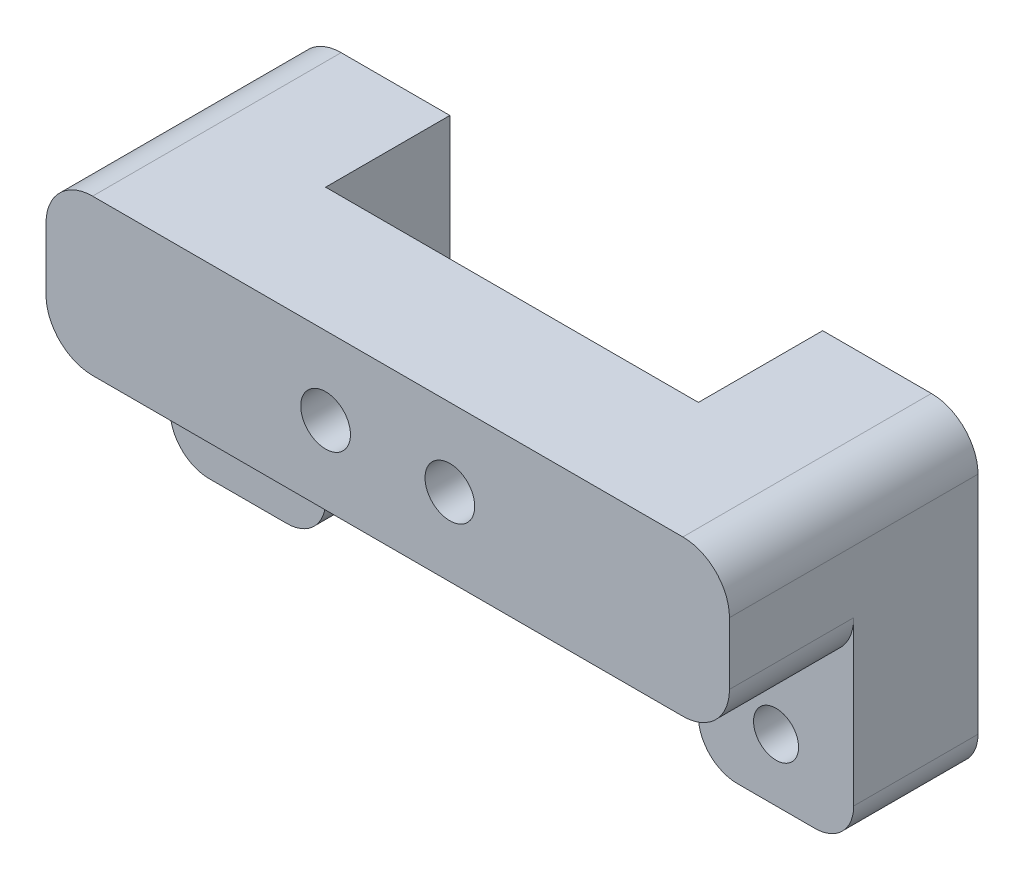
ISO-10303-21;
HEADER;
FILE_DESCRIPTION(('STEP AP214'),'2;1');
FILE_NAME('part.step','',(''),(''),'','','');
FILE_SCHEMA(('AUTOMOTIVE_DESIGN { 1 0 10303 214 1 1 1 1 }'));
ENDSEC;
DATA;
#1=APPLICATION_CONTEXT('core data for automotive mechanical design processes');
#2=APPLICATION_PROTOCOL_DEFINITION('international standard','automotive_design',2000,#1);
#3=PRODUCT_CONTEXT('',#1,'mechanical');
#4=PRODUCT('Part','Part','',(#3));
#5=PRODUCT_RELATED_PRODUCT_CATEGORY('part','',(#4));
#6=PRODUCT_DEFINITION_FORMATION('','',#4);
#7=PRODUCT_DEFINITION_CONTEXT('part definition',#1,'design');
#8=PRODUCT_DEFINITION('design','',#6,#7);
#9=PRODUCT_DEFINITION_SHAPE('','',#8);
#10=(LENGTH_UNIT() NAMED_UNIT(*) SI_UNIT(.MILLI.,.METRE.));
#11=(NAMED_UNIT(*) PLANE_ANGLE_UNIT() SI_UNIT($,.RADIAN.));
#12=(NAMED_UNIT(*) SI_UNIT($,.STERADIAN.) SOLID_ANGLE_UNIT());
#13=UNCERTAINTY_MEASURE_WITH_UNIT(LENGTH_MEASURE(1.E-05),#10,'distance_accuracy_value','');
#14=(GEOMETRIC_REPRESENTATION_CONTEXT(3) GLOBAL_UNCERTAINTY_ASSIGNED_CONTEXT((#13)) GLOBAL_UNIT_ASSIGNED_CONTEXT((#10,
#11,#12)) REPRESENTATION_CONTEXT('',''));
#15=CARTESIAN_POINT('',(0.,0.,0.));
#16=DIRECTION('',(0.,0.,1.));
#17=DIRECTION('',(1.,0.,0.));
#18=AXIS2_PLACEMENT_3D('',#15,#16,#17);
#19=CARTESIAN_POINT('',(0.,-10.,8.));
#20=DIRECTION('',(0.,1.,0.));
#21=DIRECTION('',(0.,0.,1.));
#22=AXIS2_PLACEMENT_3D('',#19,#20,#21);
#23=PLANE('',#22);
#24=DIRECTION('',(1.,0.,0.));
#25=VECTOR('',#24,1.);
#26=CARTESIAN_POINT('',(0.,-10.,8.));
#27=LINE('',#26,#25);
#28=CARTESIAN_POINT('',(3.,-10.,8.));
#29=VERTEX_POINT('',#28);
#30=CARTESIAN_POINT('',(41.,-10.,8.));
#31=VERTEX_POINT('',#30);
#32=EDGE_CURVE('E301',#29,#31,#27,.T.);
#33=ORIENTED_EDGE('',*,*,#32,.F.);
#34=DIRECTION('',(0.,0.,-1.));
#35=VECTOR('',#34,1.);
#36=CARTESIAN_POINT('',(3.,-10.,8.));
#37=LINE('',#36,#35);
#38=CARTESIAN_POINT('',(3.,-10.,0.));
#39=VERTEX_POINT('',#38);
#40=EDGE_CURVE('E254',#29,#39,#37,.T.);
#41=ORIENTED_EDGE('',*,*,#40,.T.);
#42=DIRECTION('',(-1.,0.,0.));
#43=VECTOR('',#42,1.);
#44=CARTESIAN_POINT('',(10.,-10.,0.));
#45=LINE('',#44,#43);
#46=CARTESIAN_POINT('',(10.,-10.,0.));
#47=VERTEX_POINT('',#46);
#48=EDGE_CURVE('E204',#47,#39,#45,.T.);
#49=ORIENTED_EDGE('',*,*,#48,.F.);
#50=DIRECTION('',(1.,0.,0.));
#51=VECTOR('',#50,1.);
#52=CARTESIAN_POINT('',(0.,-10.,0.));
#53=LINE('',#52,#51);
#54=CARTESIAN_POINT('',(34.,-10.,0.));
#55=VERTEX_POINT('',#54);
#56=EDGE_CURVE('E194',#47,#55,#53,.T.);
#57=ORIENTED_EDGE('',*,*,#56,.T.);
#58=DIRECTION('',(-1.,0.,0.));
#59=VECTOR('',#58,1.);
#60=CARTESIAN_POINT('',(34.,-10.,0.));
#61=LINE('',#60,#59);
#62=CARTESIAN_POINT('',(41.,-10.,0.));
#63=VERTEX_POINT('',#62);
#64=EDGE_CURVE('E164',#63,#55,#61,.T.);
#65=ORIENTED_EDGE('',*,*,#64,.F.);
#66=DIRECTION('',(0.,0.,-1.));
#67=VECTOR('',#66,1.);
#68=CARTESIAN_POINT('',(41.,-10.,8.));
#69=LINE('',#68,#67);
#70=EDGE_CURVE('E252',#63,#31,#69,.F.);
#71=ORIENTED_EDGE('',*,*,#70,.T.);
#72=EDGE_LOOP('',(#33,#41,#49,#57,#65,#71));
#73=FACE_BOUND('',#72,.T.);
#74=ADVANCED_FACE('F33',(#73),#23,.F.);
#75=CARTESIAN_POINT('',(0.,0.,0.));
#76=DIRECTION('',(0.,0.,1.));
#77=DIRECTION('',(1.,0.,0.));
#78=AXIS2_PLACEMENT_3D('',#75,#76,#77);
#79=PLANE('',#78);
#80=CARTESIAN_POINT('',(26.,-5.,0.));
#81=DIRECTION('',(0.,0.,1.));
#82=DIRECTION('',(1.,0.,0.));
#83=AXIS2_PLACEMENT_3D('',#80,#81,#82);
#84=CIRCLE('',#83,1.6);
#85=CARTESIAN_POINT('',(27.6,-5.,0.));
#86=VERTEX_POINT('',#85);
#87=EDGE_CURVE('E353',#86,#86,#84,.T.);
#88=ORIENTED_EDGE('',*,*,#87,.T.);
#89=EDGE_LOOP('',(#88));
#90=FACE_BOUND('',#89,.T.);
#91=CARTESIAN_POINT('',(18.,-5.,0.));
#92=DIRECTION('',(0.,0.,1.));
#93=DIRECTION('',(1.,0.,0.));
#94=AXIS2_PLACEMENT_3D('',#91,#92,#93);
#95=CIRCLE('',#94,1.6);
#96=CARTESIAN_POINT('',(19.6,-5.,0.));
#97=VERTEX_POINT('',#96);
#98=EDGE_CURVE('E198',#97,#97,#95,.T.);
#99=ORIENTED_EDGE('',*,*,#98,.T.);
#100=EDGE_LOOP('',(#99));
#101=FACE_BOUND('',#100,.T.);
#102=DIRECTION('',(0.,1.,0.));
#103=VECTOR('',#102,1.);
#104=CARTESIAN_POINT('',(34.,-10.,0.));
#105=LINE('',#104,#103);
#106=CARTESIAN_POINT('',(34.,0.,0.));
#107=VERTEX_POINT('',#106);
#108=EDGE_CURVE('E183',#55,#107,#105,.T.);
#109=ORIENTED_EDGE('',*,*,#108,.F.);
#110=ORIENTED_EDGE('',*,*,#56,.F.);
#111=DIRECTION('',(0.,-1.,0.));
#112=VECTOR('',#111,1.);
#113=CARTESIAN_POINT('',(10.,-10.,0.));
#114=LINE('',#113,#112);
#115=CARTESIAN_POINT('',(10.,0.,0.));
#116=VERTEX_POINT('',#115);
#117=EDGE_CURVE('E319',#116,#47,#114,.T.);
#118=ORIENTED_EDGE('',*,*,#117,.F.);
#119=DIRECTION('',(-1.,0.,0.));
#120=VECTOR('',#119,1.);
#121=CARTESIAN_POINT('',(0.,0.,0.));
#122=LINE('',#121,#120);
#123=EDGE_CURVE('E196',#107,#116,#122,.T.);
#124=ORIENTED_EDGE('',*,*,#123,.F.);
#125=EDGE_LOOP('',(#109,#110,#118,#124));
#126=FACE_BOUND('',#125,.T.);
#127=ADVANCED_FACE('F192',(#90,#101,#126),#79,.F.);
#128=CARTESIAN_POINT('',(0.,0.,8.));
#129=DIRECTION('',(1.,0.,0.));
#130=DIRECTION('',(0.,0.,-1.));
#131=AXIS2_PLACEMENT_3D('',#128,#129,#130);
#132=PLANE('',#131);
#133=DIRECTION('',(0.,1.,0.));
#134=VECTOR('',#133,1.);
#135=CARTESIAN_POINT('',(0.,-20.,0.));
#136=LINE('',#135,#134);
#137=CARTESIAN_POINT('',(0.,-17.5,0.));
#138=VERTEX_POINT('',#137);
#139=CARTESIAN_POINT('',(0.,-7.,0.));
#140=VERTEX_POINT('',#139);
#141=EDGE_CURVE('E285',#138,#140,#136,.T.);
#142=ORIENTED_EDGE('',*,*,#141,.T.);
#143=DIRECTION('',(0.,0.,-1.));
#144=VECTOR('',#143,1.);
#145=CARTESIAN_POINT('',(0.,-7.,8.));
#146=LINE('',#145,#144);
#147=CARTESIAN_POINT('',(0.,-7.,8.));
#148=VERTEX_POINT('',#147);
#149=EDGE_CURVE('E259',#140,#148,#146,.F.);
#150=ORIENTED_EDGE('',*,*,#149,.T.);
#151=DIRECTION('',(0.,-1.,0.));
#152=VECTOR('',#151,1.);
#153=CARTESIAN_POINT('',(0.,0.,8.));
#154=LINE('',#153,#152);
#155=CARTESIAN_POINT('',(0.,-3.,8.));
#156=VERTEX_POINT('',#155);
#157=EDGE_CURVE('E207',#156,#148,#154,.T.);
#158=ORIENTED_EDGE('',*,*,#157,.F.);
#159=DIRECTION('',(0.,0.,-1.));
#160=VECTOR('',#159,1.);
#161=CARTESIAN_POINT('',(0.,-3.,8.));
#162=LINE('',#161,#160);
#163=CARTESIAN_POINT('',(0.,-3.,-8.));
#164=VERTEX_POINT('',#163);
#165=EDGE_CURVE('E256',#156,#164,#162,.T.);
#166=ORIENTED_EDGE('',*,*,#165,.T.);
#167=DIRECTION('',(0.,1.,0.));
#168=VECTOR('',#167,1.);
#169=CARTESIAN_POINT('',(0.,-10.,-8.));
#170=LINE('',#169,#168);
#171=CARTESIAN_POINT('',(0.,-17.5,-8.));
#172=VERTEX_POINT('',#171);
#173=EDGE_CURVE('E314',#172,#164,#170,.T.);
#174=ORIENTED_EDGE('',*,*,#173,.F.);
#175=DIRECTION('',(0.,0.,-1.));
#176=VECTOR('',#175,1.);
#177=CARTESIAN_POINT('',(0.,-17.5,8.));
#178=LINE('',#177,#176);
#179=EDGE_CURVE('E250',#172,#138,#178,.F.);
#180=ORIENTED_EDGE('',*,*,#179,.T.);
#181=EDGE_LOOP('',(#142,#150,#158,#166,#174,#180));
#182=FACE_BOUND('',#181,.T.);
#183=ADVANCED_FACE('F294',(#182),#132,.F.);
#184=CARTESIAN_POINT('',(44.,0.,8.));
#185=DIRECTION('',(-1.,0.,0.));
#186=DIRECTION('',(0.,0.,1.));
#187=AXIS2_PLACEMENT_3D('',#184,#185,#186);
#188=PLANE('',#187);
#189=DIRECTION('',(0.,1.,0.));
#190=VECTOR('',#189,1.);
#191=CARTESIAN_POINT('',(44.,0.,8.));
#192=LINE('',#191,#190);
#193=CARTESIAN_POINT('',(44.,-7.,8.));
#194=VERTEX_POINT('',#193);
#195=CARTESIAN_POINT('',(44.,-3.,8.));
#196=VERTEX_POINT('',#195);
#197=EDGE_CURVE('E303',#194,#196,#192,.T.);
#198=ORIENTED_EDGE('',*,*,#197,.F.);
#199=DIRECTION('',(0.,0.,-1.));
#200=VECTOR('',#199,1.);
#201=CARTESIAN_POINT('',(44.,-7.,8.));
#202=LINE('',#201,#200);
#203=CARTESIAN_POINT('',(44.,-7.,0.));
#204=VERTEX_POINT('',#203);
#205=EDGE_CURVE('E271',#194,#204,#202,.T.);
#206=ORIENTED_EDGE('',*,*,#205,.T.);
#207=DIRECTION('',(0.,1.,0.));
#208=VECTOR('',#207,1.);
#209=CARTESIAN_POINT('',(44.,-20.,0.));
#210=LINE('',#209,#208);
#211=CARTESIAN_POINT('',(44.,-17.5,0.));
#212=VERTEX_POINT('',#211);
#213=EDGE_CURVE('E187',#212,#204,#210,.T.);
#214=ORIENTED_EDGE('',*,*,#213,.F.);
#215=DIRECTION('',(0.,0.,1.));
#216=VECTOR('',#215,1.);
#217=CARTESIAN_POINT('',(44.,-17.5,-8.));
#218=LINE('',#217,#216);
#219=CARTESIAN_POINT('',(44.,-17.5,-8.));
#220=VERTEX_POINT('',#219);
#221=EDGE_CURVE('E226',#212,#220,#218,.F.);
#222=ORIENTED_EDGE('',*,*,#221,.T.);
#223=DIRECTION('',(0.,-1.,0.));
#224=VECTOR('',#223,1.);
#225=CARTESIAN_POINT('',(44.,-10.,-8.));
#226=LINE('',#225,#224);
#227=CARTESIAN_POINT('',(44.,-3.,-8.));
#228=VERTEX_POINT('',#227);
#229=EDGE_CURVE('E197',#228,#220,#226,.T.);
#230=ORIENTED_EDGE('',*,*,#229,.F.);
#231=DIRECTION('',(0.,0.,-1.));
#232=VECTOR('',#231,1.);
#233=CARTESIAN_POINT('',(44.,-3.,8.));
#234=LINE('',#233,#232);
#235=EDGE_CURVE('E269',#228,#196,#234,.F.);
#236=ORIENTED_EDGE('',*,*,#235,.T.);
#237=EDGE_LOOP('',(#198,#206,#214,#222,#230,#236));
#238=FACE_BOUND('',#237,.T.);
#239=ADVANCED_FACE('F420',(#238),#188,.F.);
#240=CARTESIAN_POINT('',(0.,0.,8.));
#241=DIRECTION('',(0.,-1.,0.));
#242=DIRECTION('',(0.,0.,-1.));
#243=AXIS2_PLACEMENT_3D('',#240,#241,#242);
#244=PLANE('',#243);
#245=DIRECTION('',(-1.,0.,0.));
#246=VECTOR('',#245,1.);
#247=CARTESIAN_POINT('',(0.,0.,8.));
#248=LINE('',#247,#246);
#249=CARTESIAN_POINT('',(41.,0.,8.));
#250=VERTEX_POINT('',#249);
#251=CARTESIAN_POINT('',(3.,0.,8.));
#252=VERTEX_POINT('',#251);
#253=EDGE_CURVE('E213',#250,#252,#248,.T.);
#254=ORIENTED_EDGE('',*,*,#253,.F.);
#255=DIRECTION('',(0.,0.,-1.));
#256=VECTOR('',#255,1.);
#257=CARTESIAN_POINT('',(41.,0.,8.));
#258=LINE('',#257,#256);
#259=CARTESIAN_POINT('',(41.,0.,-8.));
#260=VERTEX_POINT('',#259);
#261=EDGE_CURVE('E276',#250,#260,#258,.T.);
#262=ORIENTED_EDGE('',*,*,#261,.T.);
#263=DIRECTION('',(1.,0.,0.));
#264=VECTOR('',#263,1.);
#265=CARTESIAN_POINT('',(44.,0.,-8.));
#266=LINE('',#265,#264);
#267=CARTESIAN_POINT('',(34.,0.,-8.));
#268=VERTEX_POINT('',#267);
#269=EDGE_CURVE('E364',#268,#260,#266,.T.);
#270=ORIENTED_EDGE('',*,*,#269,.F.);
#271=DIRECTION('',(0.,0.,1.));
#272=VECTOR('',#271,1.);
#273=CARTESIAN_POINT('',(34.,0.,-8.));
#274=LINE('',#273,#272);
#275=EDGE_CURVE('E322',#268,#107,#274,.T.);
#276=ORIENTED_EDGE('',*,*,#275,.T.);
#277=ORIENTED_EDGE('',*,*,#123,.T.);
#278=DIRECTION('',(0.,0.,1.));
#279=VECTOR('',#278,1.);
#280=CARTESIAN_POINT('',(10.,0.,-8.));
#281=LINE('',#280,#279);
#282=CARTESIAN_POINT('',(10.,0.,-8.));
#283=VERTEX_POINT('',#282);
#284=EDGE_CURVE('E205',#283,#116,#281,.T.);
#285=ORIENTED_EDGE('',*,*,#284,.F.);
#286=DIRECTION('',(1.,0.,0.));
#287=VECTOR('',#286,1.);
#288=CARTESIAN_POINT('',(0.,0.,-8.));
#289=LINE('',#288,#287);
#290=CARTESIAN_POINT('',(3.,0.,-8.));
#291=VERTEX_POINT('',#290);
#292=EDGE_CURVE('E318',#291,#283,#289,.T.);
#293=ORIENTED_EDGE('',*,*,#292,.F.);
#294=DIRECTION('',(0.,0.,-1.));
#295=VECTOR('',#294,1.);
#296=CARTESIAN_POINT('',(3.,0.,8.));
#297=LINE('',#296,#295);
#298=EDGE_CURVE('E274',#291,#252,#297,.F.);
#299=ORIENTED_EDGE('',*,*,#298,.T.);
#300=EDGE_LOOP('',(#254,#262,#270,#276,#277,#285,#293,#299));
#301=FACE_BOUND('',#300,.T.);
#302=ADVANCED_FACE('F368',(#301),#244,.F.);
#303=CARTESIAN_POINT('',(0.,0.,8.));
#304=DIRECTION('',(0.,0.,1.));
#305=DIRECTION('',(1.,0.,0.));
#306=AXIS2_PLACEMENT_3D('',#303,#304,#305);
#307=PLANE('',#306);
#308=CARTESIAN_POINT('',(26.,-5.,8.));
#309=DIRECTION('',(0.,0.,1.));
#310=DIRECTION('',(1.,0.,0.));
#311=AXIS2_PLACEMENT_3D('',#308,#309,#310);
#312=CIRCLE('',#311,1.6);
#313=CARTESIAN_POINT('',(27.6,-5.,8.));
#314=VERTEX_POINT('',#313);
#315=EDGE_CURVE('E350',#314,#314,#312,.T.);
#316=ORIENTED_EDGE('',*,*,#315,.F.);
#317=EDGE_LOOP('',(#316));
#318=FACE_BOUND('',#317,.T.);
#319=CARTESIAN_POINT('',(18.,-5.,8.));
#320=DIRECTION('',(0.,0.,1.));
#321=DIRECTION('',(1.,0.,0.));
#322=AXIS2_PLACEMENT_3D('',#319,#320,#321);
#323=CIRCLE('',#322,1.6);
#324=CARTESIAN_POINT('',(19.6,-5.,8.));
#325=VERTEX_POINT('',#324);
#326=EDGE_CURVE('E356',#325,#325,#323,.T.);
#327=ORIENTED_EDGE('',*,*,#326,.F.);
#328=EDGE_LOOP('',(#327));
#329=FACE_BOUND('',#328,.T.);
#330=ORIENTED_EDGE('',*,*,#157,.T.);
#331=CARTESIAN_POINT('',(3.,-7.,8.));
#332=DIRECTION('',(0.,0.,1.));
#333=DIRECTION('',(1.,0.,0.));
#334=AXIS2_PLACEMENT_3D('',#331,#332,#333);
#335=CIRCLE('',#334,3.);
#336=EDGE_CURVE('E267',#148,#29,#335,.T.);
#337=ORIENTED_EDGE('',*,*,#336,.T.);
#338=ORIENTED_EDGE('',*,*,#32,.T.);
#339=CARTESIAN_POINT('',(41.,-7.,8.));
#340=DIRECTION('',(0.,0.,1.));
#341=DIRECTION('',(1.,0.,0.));
#342=AXIS2_PLACEMENT_3D('',#339,#340,#341);
#343=CIRCLE('',#342,3.);
#344=EDGE_CURVE('E265',#31,#194,#343,.T.);
#345=ORIENTED_EDGE('',*,*,#344,.T.);
#346=ORIENTED_EDGE('',*,*,#197,.T.);
#347=CARTESIAN_POINT('',(41.,-3.,8.));
#348=DIRECTION('',(0.,0.,1.));
#349=DIRECTION('',(1.,0.,0.));
#350=AXIS2_PLACEMENT_3D('',#347,#348,#349);
#351=CIRCLE('',#350,3.);
#352=EDGE_CURVE('E263',#196,#250,#351,.T.);
#353=ORIENTED_EDGE('',*,*,#352,.T.);
#354=ORIENTED_EDGE('',*,*,#253,.T.);
#355=CARTESIAN_POINT('',(3.,-3.,8.));
#356=DIRECTION('',(0.,0.,1.));
#357=DIRECTION('',(1.,0.,0.));
#358=AXIS2_PLACEMENT_3D('',#355,#356,#357);
#359=CIRCLE('',#358,3.);
#360=EDGE_CURVE('E261',#252,#156,#359,.T.);
#361=ORIENTED_EDGE('',*,*,#360,.T.);
#362=EDGE_LOOP('',(#330,#337,#338,#345,#346,#353,#354,#361));
#363=FACE_BOUND('',#362,.T.);
#364=ADVANCED_FACE('F297',(#318,#329,#363),#307,.T.);
#365=CARTESIAN_POINT('',(10.,-10.,-8.));
#366=DIRECTION('',(-1.,0.,0.));
#367=DIRECTION('',(0.,-1.,0.));
#368=AXIS2_PLACEMENT_3D('',#365,#366,#367);
#369=PLANE('',#368);
#370=DIRECTION('',(0.,1.,0.));
#371=VECTOR('',#370,1.);
#372=CARTESIAN_POINT('',(10.,-20.,0.));
#373=LINE('',#372,#371);
#374=CARTESIAN_POINT('',(10.,-17.5,0.));
#375=VERTEX_POINT('',#374);
#376=EDGE_CURVE('E348',#375,#47,#373,.T.);
#377=ORIENTED_EDGE('',*,*,#376,.F.);
#378=DIRECTION('',(0.,0.,1.));
#379=VECTOR('',#378,1.);
#380=CARTESIAN_POINT('',(10.,-17.5,-8.));
#381=LINE('',#380,#379);
#382=CARTESIAN_POINT('',(10.,-17.5,-8.));
#383=VERTEX_POINT('',#382);
#384=EDGE_CURVE('E244',#375,#383,#381,.F.);
#385=ORIENTED_EDGE('',*,*,#384,.T.);
#386=DIRECTION('',(0.,-1.,0.));
#387=VECTOR('',#386,1.);
#388=CARTESIAN_POINT('',(10.,-10.,-8.));
#389=LINE('',#388,#387);
#390=EDGE_CURVE('E210',#283,#383,#389,.T.);
#391=ORIENTED_EDGE('',*,*,#390,.F.);
#392=ORIENTED_EDGE('',*,*,#284,.T.);
#393=ORIENTED_EDGE('',*,*,#117,.T.);
#394=EDGE_LOOP('',(#377,#385,#391,#392,#393));
#395=FACE_BOUND('',#394,.T.);
#396=ADVANCED_FACE('F467',(#395),#369,.F.);
#397=CARTESIAN_POINT('',(0.,0.,-8.));
#398=DIRECTION('',(0.,0.,-1.));
#399=DIRECTION('',(-1.,0.,0.));
#400=AXIS2_PLACEMENT_3D('',#397,#398,#399);
#401=PLANE('',#400);
#402=CARTESIAN_POINT('',(5.,-16.,-8.));
#403=DIRECTION('',(0.,0.,1.));
#404=DIRECTION('',(1.,0.,0.));
#405=AXIS2_PLACEMENT_3D('',#402,#403,#404);
#406=CIRCLE('',#405,1.45);
#407=CARTESIAN_POINT('',(6.45,-16.,-8.));
#408=VERTEX_POINT('',#407);
#409=EDGE_CURVE('E175',#408,#408,#406,.T.);
#410=ORIENTED_EDGE('',*,*,#409,.T.);
#411=EDGE_LOOP('',(#410));
#412=FACE_BOUND('',#411,.T.);
#413=ORIENTED_EDGE('',*,*,#173,.T.);
#414=CARTESIAN_POINT('',(3.,-3.,-8.));
#415=DIRECTION('',(0.,0.,-1.));
#416=DIRECTION('',(-1.,0.,0.));
#417=AXIS2_PLACEMENT_3D('',#414,#415,#416);
#418=CIRCLE('',#417,3.);
#419=EDGE_CURVE('E48',#164,#291,#418,.T.);
#420=ORIENTED_EDGE('',*,*,#419,.T.);
#421=ORIENTED_EDGE('',*,*,#292,.T.);
#422=ORIENTED_EDGE('',*,*,#390,.T.);
#423=CARTESIAN_POINT('',(7.5,-17.5,-8.));
#424=DIRECTION('',(0.,0.,-1.));
#425=DIRECTION('',(-1.,0.,0.));
#426=AXIS2_PLACEMENT_3D('',#423,#424,#425);
#427=CIRCLE('',#426,2.5);
#428=CARTESIAN_POINT('',(7.5,-20.,-8.));
#429=VERTEX_POINT('',#428);
#430=EDGE_CURVE('E248',#383,#429,#427,.T.);
#431=ORIENTED_EDGE('',*,*,#430,.T.);
#432=DIRECTION('',(1.,0.,0.));
#433=VECTOR('',#432,1.);
#434=CARTESIAN_POINT('',(10.,-20.,-8.));
#435=LINE('',#434,#433);
#436=CARTESIAN_POINT('',(2.5,-20.,-8.));
#437=VERTEX_POINT('',#436);
#438=EDGE_CURVE('E340',#437,#429,#435,.T.);
#439=ORIENTED_EDGE('',*,*,#438,.F.);
#440=CARTESIAN_POINT('',(2.5,-17.5,-8.));
#441=DIRECTION('',(0.,0.,-1.));
#442=DIRECTION('',(-1.,0.,0.));
#443=AXIS2_PLACEMENT_3D('',#440,#441,#442);
#444=CIRCLE('',#443,2.5);
#445=EDGE_CURVE('E246',#437,#172,#444,.T.);
#446=ORIENTED_EDGE('',*,*,#445,.T.);
#447=EDGE_LOOP('',(#413,#420,#421,#422,#431,#439,#446));
#448=FACE_BOUND('',#447,.T.);
#449=ADVANCED_FACE('F316',(#412,#448),#401,.T.);
#450=CARTESIAN_POINT('',(34.,-10.,-8.));
#451=DIRECTION('',(1.,0.,0.));
#452=DIRECTION('',(0.,0.,-1.));
#453=AXIS2_PLACEMENT_3D('',#450,#451,#452);
#454=PLANE('',#453);
#455=DIRECTION('',(0.,1.,0.));
#456=VECTOR('',#455,1.);
#457=CARTESIAN_POINT('',(34.,-10.,-8.));
#458=LINE('',#457,#456);
#459=CARTESIAN_POINT('',(34.,-17.5,-8.));
#460=VERTEX_POINT('',#459);
#461=EDGE_CURVE('E362',#460,#268,#458,.T.);
#462=ORIENTED_EDGE('',*,*,#461,.F.);
#463=DIRECTION('',(0.,0.,-1.));
#464=VECTOR('',#463,1.);
#465=CARTESIAN_POINT('',(34.,-17.5,0.));
#466=LINE('',#465,#464);
#467=CARTESIAN_POINT('',(34.,-17.5,0.));
#468=VERTEX_POINT('',#467);
#469=EDGE_CURVE('E186',#460,#468,#466,.F.);
#470=ORIENTED_EDGE('',*,*,#469,.T.);
#471=DIRECTION('',(0.,1.,0.));
#472=VECTOR('',#471,1.);
#473=CARTESIAN_POINT('',(34.,-20.,0.));
#474=LINE('',#473,#472);
#475=EDGE_CURVE('E168',#468,#55,#474,.T.);
#476=ORIENTED_EDGE('',*,*,#475,.T.);
#477=ORIENTED_EDGE('',*,*,#108,.T.);
#478=ORIENTED_EDGE('',*,*,#275,.F.);
#479=EDGE_LOOP('',(#462,#470,#476,#477,#478));
#480=FACE_BOUND('',#479,.T.);
#481=ADVANCED_FACE('F181',(#480),#454,.F.);
#482=CARTESIAN_POINT('',(0.,0.,-8.));
#483=DIRECTION('',(0.,0.,1.));
#484=DIRECTION('',(1.,0.,0.));
#485=AXIS2_PLACEMENT_3D('',#482,#483,#484);
#486=PLANE('',#485);
#487=CARTESIAN_POINT('',(39.,-16.,-8.));
#488=DIRECTION('',(0.,0.,1.));
#489=DIRECTION('',(1.,0.,0.));
#490=AXIS2_PLACEMENT_3D('',#487,#488,#489);
#491=CIRCLE('',#490,1.45);
#492=CARTESIAN_POINT('',(40.45,-16.,-8.));
#493=VERTEX_POINT('',#492);
#494=EDGE_CURVE('E384',#493,#493,#491,.T.);
#495=ORIENTED_EDGE('',*,*,#494,.T.);
#496=EDGE_LOOP('',(#495));
#497=FACE_BOUND('',#496,.T.);
#498=ORIENTED_EDGE('',*,*,#269,.T.);
#499=CARTESIAN_POINT('',(41.,-3.,-8.));
#500=DIRECTION('',(0.,0.,1.));
#501=DIRECTION('',(1.,0.,0.));
#502=AXIS2_PLACEMENT_3D('',#499,#500,#501);
#503=CIRCLE('',#502,3.);
#504=EDGE_CURVE('E56',#260,#228,#503,.F.);
#505=ORIENTED_EDGE('',*,*,#504,.T.);
#506=ORIENTED_EDGE('',*,*,#229,.T.);
#507=CARTESIAN_POINT('',(41.5,-17.5,-8.));
#508=DIRECTION('',(0.,0.,1.));
#509=DIRECTION('',(1.,0.,0.));
#510=AXIS2_PLACEMENT_3D('',#507,#508,#509);
#511=CIRCLE('',#510,2.5);
#512=CARTESIAN_POINT('',(41.5,-20.,-8.));
#513=VERTEX_POINT('',#512);
#514=EDGE_CURVE('E231',#220,#513,#511,.F.);
#515=ORIENTED_EDGE('',*,*,#514,.T.);
#516=DIRECTION('',(1.,0.,0.));
#517=VECTOR('',#516,1.);
#518=CARTESIAN_POINT('',(34.,-20.,-8.));
#519=LINE('',#518,#517);
#520=CARTESIAN_POINT('',(36.5,-20.,-8.));
#521=VERTEX_POINT('',#520);
#522=EDGE_CURVE('E174',#521,#513,#519,.T.);
#523=ORIENTED_EDGE('',*,*,#522,.F.);
#524=CARTESIAN_POINT('',(36.5,-17.5,-8.));
#525=DIRECTION('',(0.,0.,1.));
#526=DIRECTION('',(1.,0.,0.));
#527=AXIS2_PLACEMENT_3D('',#524,#525,#526);
#528=CIRCLE('',#527,2.5);
#529=EDGE_CURVE('E229',#521,#460,#528,.F.);
#530=ORIENTED_EDGE('',*,*,#529,.T.);
#531=ORIENTED_EDGE('',*,*,#461,.T.);
#532=EDGE_LOOP('',(#498,#505,#506,#515,#523,#530,#531));
#533=FACE_BOUND('',#532,.T.);
#534=ADVANCED_FACE('F393',(#497,#533),#486,.F.);
#535=CARTESIAN_POINT('',(18.,-5.,-8.));
#536=DIRECTION('',(0.,0.,1.));
#537=DIRECTION('',(1.,0.,0.));
#538=AXIS2_PLACEMENT_3D('',#535,#536,#537);
#539=CYLINDRICAL_SURFACE('',#538,1.6);
#540=ORIENTED_EDGE('',*,*,#326,.T.);
#541=EDGE_LOOP('',(#540));
#542=FACE_BOUND('',#541,.T.);
#543=ORIENTED_EDGE('',*,*,#98,.F.);
#544=EDGE_LOOP('',(#543));
#545=FACE_BOUND('',#544,.T.);
#546=ADVANCED_FACE('F453',(#542,#545),#539,.F.);
#547=CARTESIAN_POINT('',(26.,-5.,-8.));
#548=DIRECTION('',(0.,0.,1.));
#549=DIRECTION('',(1.,0.,0.));
#550=AXIS2_PLACEMENT_3D('',#547,#548,#549);
#551=CYLINDRICAL_SURFACE('',#550,1.6);
#552=ORIENTED_EDGE('',*,*,#315,.T.);
#553=EDGE_LOOP('',(#552));
#554=FACE_BOUND('',#553,.T.);
#555=ORIENTED_EDGE('',*,*,#87,.F.);
#556=EDGE_LOOP('',(#555));
#557=FACE_BOUND('',#556,.T.);
#558=ADVANCED_FACE('F459',(#554,#557),#551,.F.);
#559=CARTESIAN_POINT('',(10.,-20.,0.));
#560=DIRECTION('',(0.,0.,-1.));
#561=DIRECTION('',(-1.,0.,0.));
#562=AXIS2_PLACEMENT_3D('',#559,#560,#561);
#563=PLANE('',#562);
#564=CARTESIAN_POINT('',(5.,-16.,0.));
#565=DIRECTION('',(0.,0.,1.));
#566=DIRECTION('',(1.,0.,0.));
#567=AXIS2_PLACEMENT_3D('',#564,#565,#566);
#568=CIRCLE('',#567,1.45);
#569=CARTESIAN_POINT('',(6.45,-16.,0.));
#570=VERTEX_POINT('',#569);
#571=EDGE_CURVE('E381',#570,#570,#568,.T.);
#572=ORIENTED_EDGE('',*,*,#571,.F.);
#573=EDGE_LOOP('',(#572));
#574=FACE_BOUND('',#573,.T.);
#575=DIRECTION('',(-1.,0.,0.));
#576=VECTOR('',#575,1.);
#577=CARTESIAN_POINT('',(10.,-20.,0.));
#578=LINE('',#577,#576);
#579=CARTESIAN_POINT('',(7.5,-20.,0.));
#580=VERTEX_POINT('',#579);
#581=CARTESIAN_POINT('',(2.5,-20.,0.));
#582=VERTEX_POINT('',#581);
#583=EDGE_CURVE('E338',#580,#582,#578,.T.);
#584=ORIENTED_EDGE('',*,*,#583,.F.);
#585=CARTESIAN_POINT('',(7.5,-17.5,0.));
#586=DIRECTION('',(0.,0.,-1.));
#587=DIRECTION('',(-1.,0.,0.));
#588=AXIS2_PLACEMENT_3D('',#585,#586,#587);
#589=CIRCLE('',#588,2.5);
#590=EDGE_CURVE('E242',#580,#375,#589,.F.);
#591=ORIENTED_EDGE('',*,*,#590,.T.);
#592=ORIENTED_EDGE('',*,*,#376,.T.);
#593=ORIENTED_EDGE('',*,*,#48,.T.);
#594=CARTESIAN_POINT('',(3.,-7.,0.));
#595=DIRECTION('',(0.,0.,-1.));
#596=DIRECTION('',(-1.,0.,0.));
#597=AXIS2_PLACEMENT_3D('',#594,#595,#596);
#598=CIRCLE('',#597,3.);
#599=EDGE_CURVE('E41',#39,#140,#598,.T.);
#600=ORIENTED_EDGE('',*,*,#599,.T.);
#601=ORIENTED_EDGE('',*,*,#141,.F.);
#602=CARTESIAN_POINT('',(2.5,-17.5,0.));
#603=DIRECTION('',(0.,0.,-1.));
#604=DIRECTION('',(-1.,0.,0.));
#605=AXIS2_PLACEMENT_3D('',#602,#603,#604);
#606=CIRCLE('',#605,2.5);
#607=EDGE_CURVE('E240',#138,#582,#606,.F.);
#608=ORIENTED_EDGE('',*,*,#607,.T.);
#609=EDGE_LOOP('',(#584,#591,#592,#593,#600,#601,#608));
#610=FACE_BOUND('',#609,.T.);
#611=ADVANCED_FACE('F284',(#574,#610),#563,.F.);
#612=CARTESIAN_POINT('',(0.,-20.,0.));
#613=DIRECTION('',(0.,1.,0.));
#614=DIRECTION('',(0.,0.,1.));
#615=AXIS2_PLACEMENT_3D('',#612,#613,#614);
#616=PLANE('',#615);
#617=ORIENTED_EDGE('',*,*,#438,.T.);
#618=DIRECTION('',(0.,0.,1.));
#619=VECTOR('',#618,1.);
#620=CARTESIAN_POINT('',(7.5,-20.,0.));
#621=LINE('',#620,#619);
#622=EDGE_CURVE('E237',#429,#580,#621,.T.);
#623=ORIENTED_EDGE('',*,*,#622,.T.);
#624=ORIENTED_EDGE('',*,*,#583,.T.);
#625=DIRECTION('',(0.,0.,-1.));
#626=VECTOR('',#625,1.);
#627=CARTESIAN_POINT('',(2.5,-20.,0.));
#628=LINE('',#627,#626);
#629=EDGE_CURVE('E234',#582,#437,#628,.T.);
#630=ORIENTED_EDGE('',*,*,#629,.T.);
#631=EDGE_LOOP('',(#617,#623,#624,#630));
#632=FACE_BOUND('',#631,.T.);
#633=ADVANCED_FACE('F337',(#632),#616,.F.);
#634=CARTESIAN_POINT('',(34.,-20.,0.));
#635=DIRECTION('',(0.,0.,-1.));
#636=DIRECTION('',(-1.,0.,0.));
#637=AXIS2_PLACEMENT_3D('',#634,#635,#636);
#638=PLANE('',#637);
#639=CARTESIAN_POINT('',(39.,-16.,0.));
#640=DIRECTION('',(0.,0.,1.));
#641=DIRECTION('',(1.,0.,0.));
#642=AXIS2_PLACEMENT_3D('',#639,#640,#641);
#643=CIRCLE('',#642,1.45);
#644=CARTESIAN_POINT('',(40.45,-16.,0.));
#645=VERTEX_POINT('',#644);
#646=EDGE_CURVE('E387',#645,#645,#643,.T.);
#647=ORIENTED_EDGE('',*,*,#646,.F.);
#648=EDGE_LOOP('',(#647));
#649=FACE_BOUND('',#648,.T.);
#650=DIRECTION('',(-1.,0.,0.));
#651=VECTOR('',#650,1.);
#652=CARTESIAN_POINT('',(34.,-20.,0.));
#653=LINE('',#652,#651);
#654=CARTESIAN_POINT('',(41.5,-20.,0.));
#655=VERTEX_POINT('',#654);
#656=CARTESIAN_POINT('',(36.5,-20.,0.));
#657=VERTEX_POINT('',#656);
#658=EDGE_CURVE('E188',#655,#657,#653,.T.);
#659=ORIENTED_EDGE('',*,*,#658,.F.);
#660=CARTESIAN_POINT('',(41.5,-17.5,0.));
#661=DIRECTION('',(0.,0.,-1.));
#662=DIRECTION('',(-1.,0.,0.));
#663=AXIS2_PLACEMENT_3D('',#660,#661,#662);
#664=CIRCLE('',#663,2.5);
#665=EDGE_CURVE('E224',#655,#212,#664,.F.);
#666=ORIENTED_EDGE('',*,*,#665,.T.);
#667=ORIENTED_EDGE('',*,*,#213,.T.);
#668=CARTESIAN_POINT('',(41.,-7.,0.));
#669=DIRECTION('',(0.,0.,-1.));
#670=DIRECTION('',(-1.,0.,0.));
#671=AXIS2_PLACEMENT_3D('',#668,#669,#670);
#672=CIRCLE('',#671,3.);
#673=EDGE_CURVE('E11',#204,#63,#672,.T.);
#674=ORIENTED_EDGE('',*,*,#673,.T.);
#675=ORIENTED_EDGE('',*,*,#64,.T.);
#676=ORIENTED_EDGE('',*,*,#475,.F.);
#677=CARTESIAN_POINT('',(36.5,-17.5,0.));
#678=DIRECTION('',(0.,0.,-1.));
#679=DIRECTION('',(-1.,0.,0.));
#680=AXIS2_PLACEMENT_3D('',#677,#678,#679);
#681=CIRCLE('',#680,2.5);
#682=EDGE_CURVE('E222',#468,#657,#681,.F.);
#683=ORIENTED_EDGE('',*,*,#682,.T.);
#684=EDGE_LOOP('',(#659,#666,#667,#674,#675,#676,#683));
#685=FACE_BOUND('',#684,.T.);
#686=ADVANCED_FACE('F167',(#649,#685),#638,.F.);
#687=CARTESIAN_POINT('',(0.,-20.,0.));
#688=DIRECTION('',(0.,-1.,0.));
#689=DIRECTION('',(0.,0.,-1.));
#690=AXIS2_PLACEMENT_3D('',#687,#688,#689);
#691=PLANE('',#690);
#692=ORIENTED_EDGE('',*,*,#522,.T.);
#693=DIRECTION('',(0.,0.,1.));
#694=VECTOR('',#693,1.);
#695=CARTESIAN_POINT('',(41.5,-20.,0.));
#696=LINE('',#695,#694);
#697=EDGE_CURVE('E219',#513,#655,#696,.T.);
#698=ORIENTED_EDGE('',*,*,#697,.T.);
#699=ORIENTED_EDGE('',*,*,#658,.T.);
#700=DIRECTION('',(0.,0.,-1.));
#701=VECTOR('',#700,1.);
#702=CARTESIAN_POINT('',(36.5,-20.,-8.));
#703=LINE('',#702,#701);
#704=EDGE_CURVE('E216',#657,#521,#703,.T.);
#705=ORIENTED_EDGE('',*,*,#704,.T.);
#706=EDGE_LOOP('',(#692,#698,#699,#705));
#707=FACE_BOUND('',#706,.T.);
#708=ADVANCED_FACE('F375',(#707),#691,.T.);
#709=CARTESIAN_POINT('',(5.,-16.,-8.));
#710=DIRECTION('',(0.,0.,1.));
#711=DIRECTION('',(1.,0.,0.));
#712=AXIS2_PLACEMENT_3D('',#709,#710,#711);
#713=CYLINDRICAL_SURFACE('',#712,1.45);
#714=ORIENTED_EDGE('',*,*,#409,.F.);
#715=EDGE_LOOP('',(#714));
#716=FACE_BOUND('',#715,.T.);
#717=ORIENTED_EDGE('',*,*,#571,.T.);
#718=EDGE_LOOP('',(#717));
#719=FACE_BOUND('',#718,.T.);
#720=ADVANCED_FACE('F399',(#716,#719),#713,.F.);
#721=CARTESIAN_POINT('',(39.,-16.,-8.));
#722=DIRECTION('',(0.,0.,1.));
#723=DIRECTION('',(1.,0.,0.));
#724=AXIS2_PLACEMENT_3D('',#721,#722,#723);
#725=CYLINDRICAL_SURFACE('',#724,1.45);
#726=ORIENTED_EDGE('',*,*,#494,.F.);
#727=EDGE_LOOP('',(#726));
#728=FACE_BOUND('',#727,.T.);
#729=ORIENTED_EDGE('',*,*,#646,.T.);
#730=EDGE_LOOP('',(#729));
#731=FACE_BOUND('',#730,.T.);
#732=ADVANCED_FACE('F395',(#728,#731),#725,.F.);
#733=CARTESIAN_POINT('',(41.5,-17.5,0.));
#734=DIRECTION('',(0.,0.,-1.));
#735=DIRECTION('',(-1.,0.,0.));
#736=AXIS2_PLACEMENT_3D('',#733,#734,#735);
#737=CYLINDRICAL_SURFACE('',#736,2.5);
#738=ORIENTED_EDGE('',*,*,#514,.F.);
#739=ORIENTED_EDGE('',*,*,#221,.F.);
#740=ORIENTED_EDGE('',*,*,#665,.F.);
#741=ORIENTED_EDGE('',*,*,#697,.F.);
#742=EDGE_LOOP('',(#738,#739,#740,#741));
#743=FACE_BOUND('',#742,.T.);
#744=ADVANCED_FACE('F398',(#743),#737,.T.);
#745=CARTESIAN_POINT('',(36.5,-17.5,0.));
#746=DIRECTION('',(0.,0.,1.));
#747=DIRECTION('',(1.,0.,0.));
#748=AXIS2_PLACEMENT_3D('',#745,#746,#747);
#749=CYLINDRICAL_SURFACE('',#748,2.5);
#750=ORIENTED_EDGE('',*,*,#682,.F.);
#751=ORIENTED_EDGE('',*,*,#469,.F.);
#752=ORIENTED_EDGE('',*,*,#529,.F.);
#753=ORIENTED_EDGE('',*,*,#704,.F.);
#754=EDGE_LOOP('',(#750,#751,#752,#753));
#755=FACE_BOUND('',#754,.T.);
#756=ADVANCED_FACE('F370',(#755),#749,.T.);
#757=CARTESIAN_POINT('',(7.5,-17.5,0.));
#758=DIRECTION('',(0.,0.,1.));
#759=DIRECTION('',(1.,0.,0.));
#760=AXIS2_PLACEMENT_3D('',#757,#758,#759);
#761=CYLINDRICAL_SURFACE('',#760,2.5);
#762=ORIENTED_EDGE('',*,*,#430,.F.);
#763=ORIENTED_EDGE('',*,*,#384,.F.);
#764=ORIENTED_EDGE('',*,*,#590,.F.);
#765=ORIENTED_EDGE('',*,*,#622,.F.);
#766=EDGE_LOOP('',(#762,#763,#764,#765));
#767=FACE_BOUND('',#766,.T.);
#768=ADVANCED_FACE('F334',(#767),#761,.T.);
#769=CARTESIAN_POINT('',(2.5,-17.5,0.));
#770=DIRECTION('',(0.,0.,-1.));
#771=DIRECTION('',(-1.,0.,0.));
#772=AXIS2_PLACEMENT_3D('',#769,#770,#771);
#773=CYLINDRICAL_SURFACE('',#772,2.5);
#774=ORIENTED_EDGE('',*,*,#607,.F.);
#775=ORIENTED_EDGE('',*,*,#179,.F.);
#776=ORIENTED_EDGE('',*,*,#445,.F.);
#777=ORIENTED_EDGE('',*,*,#629,.F.);
#778=EDGE_LOOP('',(#774,#775,#776,#777));
#779=FACE_BOUND('',#778,.T.);
#780=ADVANCED_FACE('F431',(#779),#773,.T.);
#781=CARTESIAN_POINT('',(3.,-7.,8.));
#782=DIRECTION('',(0.,0.,-1.));
#783=DIRECTION('',(-1.,0.,0.));
#784=AXIS2_PLACEMENT_3D('',#781,#782,#783);
#785=CYLINDRICAL_SURFACE('',#784,3.);
#786=ORIENTED_EDGE('',*,*,#336,.F.);
#787=ORIENTED_EDGE('',*,*,#149,.F.);
#788=ORIENTED_EDGE('',*,*,#599,.F.);
#789=ORIENTED_EDGE('',*,*,#40,.F.);
#790=EDGE_LOOP('',(#786,#787,#788,#789));
#791=FACE_BOUND('',#790,.T.);
#792=ADVANCED_FACE('F290',(#791),#785,.T.);
#793=CARTESIAN_POINT('',(41.,-7.,8.));
#794=DIRECTION('',(0.,0.,-1.));
#795=DIRECTION('',(-1.,0.,0.));
#796=AXIS2_PLACEMENT_3D('',#793,#794,#795);
#797=CYLINDRICAL_SURFACE('',#796,3.);
#798=ORIENTED_EDGE('',*,*,#344,.F.);
#799=ORIENTED_EDGE('',*,*,#70,.F.);
#800=ORIENTED_EDGE('',*,*,#673,.F.);
#801=ORIENTED_EDGE('',*,*,#205,.F.);
#802=EDGE_LOOP('',(#798,#799,#800,#801));
#803=FACE_BOUND('',#802,.T.);
#804=ADVANCED_FACE('F437',(#803),#797,.T.);
#805=CARTESIAN_POINT('',(41.,-3.,8.));
#806=DIRECTION('',(0.,0.,-1.));
#807=DIRECTION('',(-1.,0.,0.));
#808=AXIS2_PLACEMENT_3D('',#805,#806,#807);
#809=CYLINDRICAL_SURFACE('',#808,3.);
#810=ORIENTED_EDGE('',*,*,#352,.F.);
#811=ORIENTED_EDGE('',*,*,#235,.F.);
#812=ORIENTED_EDGE('',*,*,#504,.F.);
#813=ORIENTED_EDGE('',*,*,#261,.F.);
#814=EDGE_LOOP('',(#810,#811,#812,#813));
#815=FACE_BOUND('',#814,.T.);
#816=ADVANCED_FACE('F439',(#815),#809,.T.);
#817=CARTESIAN_POINT('',(3.,-3.,8.));
#818=DIRECTION('',(0.,0.,-1.));
#819=DIRECTION('',(-1.,0.,0.));
#820=AXIS2_PLACEMENT_3D('',#817,#818,#819);
#821=CYLINDRICAL_SURFACE('',#820,3.);
#822=ORIENTED_EDGE('',*,*,#360,.F.);
#823=ORIENTED_EDGE('',*,*,#298,.F.);
#824=ORIENTED_EDGE('',*,*,#419,.F.);
#825=ORIENTED_EDGE('',*,*,#165,.F.);
#826=EDGE_LOOP('',(#822,#823,#824,#825));
#827=FACE_BOUND('',#826,.T.);
#828=ADVANCED_FACE('F35',(#827),#821,.T.);
#829=CLOSED_SHELL('',(#74,#127,#183,#239,#302,#364,#396,#449,#481,#534,#546,#558,#611,#633,#686,
#708,#720,#732,#744,#756,#768,#780,#792,#804,#816,#828));
#830=MANIFOLD_SOLID_BREP('B2',#829);
#831=ADVANCED_BREP_SHAPE_REPRESENTATION('',(#18,#830),#14);
#832=SHAPE_DEFINITION_REPRESENTATION(#9,#831);
ENDSEC;
END-ISO-10303-21;
